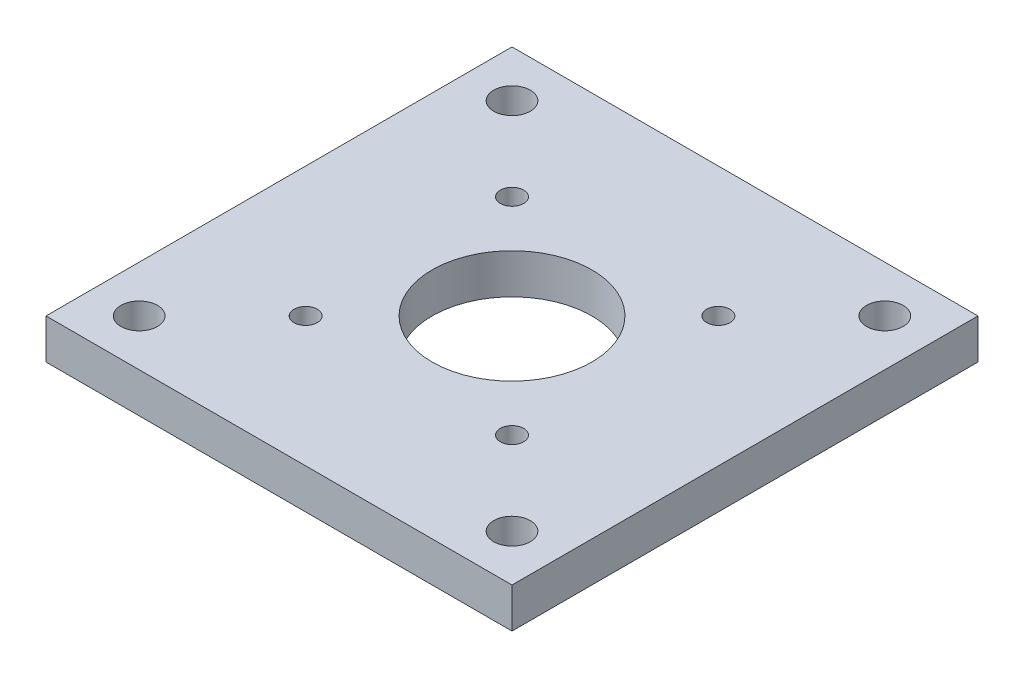
ISO-10303-21;
HEADER;
FILE_DESCRIPTION(('STEP AP214'),'2;1');
FILE_NAME('part.step','',(''),(''),'','','');
FILE_SCHEMA(('AUTOMOTIVE_DESIGN { 1 0 10303 214 1 1 1 1 }'));
ENDSEC;
DATA;
#1=APPLICATION_CONTEXT('core data for automotive mechanical design processes');
#2=APPLICATION_PROTOCOL_DEFINITION('international standard','automotive_design',2000,#1);
#3=PRODUCT_CONTEXT('',#1,'mechanical');
#4=PRODUCT('Part','Part','',(#3));
#5=PRODUCT_RELATED_PRODUCT_CATEGORY('part','',(#4));
#6=PRODUCT_DEFINITION_FORMATION('','',#4);
#7=PRODUCT_DEFINITION_CONTEXT('part definition',#1,'design');
#8=PRODUCT_DEFINITION('design','',#6,#7);
#9=PRODUCT_DEFINITION_SHAPE('','',#8);
#10=(LENGTH_UNIT() NAMED_UNIT(*) SI_UNIT(.MILLI.,.METRE.));
#11=(NAMED_UNIT(*) PLANE_ANGLE_UNIT() SI_UNIT($,.RADIAN.));
#12=(NAMED_UNIT(*) SI_UNIT($,.STERADIAN.) SOLID_ANGLE_UNIT());
#13=UNCERTAINTY_MEASURE_WITH_UNIT(LENGTH_MEASURE(1.E-05),#10,'distance_accuracy_value','');
#14=(GEOMETRIC_REPRESENTATION_CONTEXT(3) GLOBAL_UNCERTAINTY_ASSIGNED_CONTEXT((#13)) GLOBAL_UNIT_ASSIGNED_CONTEXT((#10,
#11,#12)) REPRESENTATION_CONTEXT('',''));
#15=CARTESIAN_POINT('',(0.,0.,0.));
#16=DIRECTION('',(0.,0.,1.));
#17=DIRECTION('',(1.,0.,0.));
#18=AXIS2_PLACEMENT_3D('',#15,#16,#17);
#19=CARTESIAN_POINT('',(0.,6.,0.));
#20=DIRECTION('',(0.,-1.,0.));
#21=DIRECTION('',(0.,0.,-1.));
#22=AXIS2_PLACEMENT_3D('',#19,#20,#21);
#23=PLANE('',#22);
#24=CARTESIAN_POINT('',(-28.,6.,28.));
#25=DIRECTION('',(0.,1.,0.));
#26=DIRECTION('',(0.,0.,-1.));
#27=AXIS2_PLACEMENT_3D('',#24,#25,#26);
#28=CIRCLE('',#27,2.75);
#29=CARTESIAN_POINT('',(-28.,6.,25.25));
#30=VERTEX_POINT('',#29);
#31=EDGE_CURVE('E160',#30,#30,#28,.T.);
#32=ORIENTED_EDGE('',*,*,#31,.F.);
#33=EDGE_LOOP('',(#32));
#34=FACE_BOUND('',#33,.T.);
#35=CARTESIAN_POINT('',(28.,6.,28.));
#36=DIRECTION('',(0.,1.,0.));
#37=DIRECTION('',(0.,0.,1.));
#38=AXIS2_PLACEMENT_3D('',#35,#36,#37);
#39=CIRCLE('',#38,2.75);
#40=CARTESIAN_POINT('',(28.,6.,30.75));
#41=VERTEX_POINT('',#40);
#42=EDGE_CURVE('E162',#41,#41,#39,.T.);
#43=ORIENTED_EDGE('',*,*,#42,.F.);
#44=EDGE_LOOP('',(#43));
#45=FACE_BOUND('',#44,.T.);
#46=CARTESIAN_POINT('',(28.,6.,-28.));
#47=DIRECTION('',(0.,1.,0.));
#48=DIRECTION('',(0.,0.,-1.));
#49=AXIS2_PLACEMENT_3D('',#46,#47,#48);
#50=CIRCLE('',#49,2.75);
#51=CARTESIAN_POINT('',(28.,6.,-30.75));
#52=VERTEX_POINT('',#51);
#53=EDGE_CURVE('E151',#52,#52,#50,.T.);
#54=ORIENTED_EDGE('',*,*,#53,.F.);
#55=EDGE_LOOP('',(#54));
#56=FACE_BOUND('',#55,.T.);
#57=CARTESIAN_POINT('',(-28.,6.,-28.));
#58=DIRECTION('',(0.,1.,0.));
#59=DIRECTION('',(0.,0.,1.));
#60=AXIS2_PLACEMENT_3D('',#57,#58,#59);
#61=CIRCLE('',#60,2.75);
#62=CARTESIAN_POINT('',(-28.,6.,-25.25));
#63=VERTEX_POINT('',#62);
#64=EDGE_CURVE('E146',#63,#63,#61,.T.);
#65=ORIENTED_EDGE('',*,*,#64,.F.);
#66=EDGE_LOOP('',(#65));
#67=FACE_BOUND('',#66,.T.);
#68=CARTESIAN_POINT('',(-15.5,6.,15.5));
#69=DIRECTION('',(0.,1.,0.));
#70=DIRECTION('',(0.,0.,-1.));
#71=AXIS2_PLACEMENT_3D('',#68,#69,#70);
#72=CIRCLE('',#71,1.75);
#73=CARTESIAN_POINT('',(-15.5,6.,13.75));
#74=VERTEX_POINT('',#73);
#75=EDGE_CURVE('E134',#74,#74,#72,.T.);
#76=ORIENTED_EDGE('',*,*,#75,.F.);
#77=EDGE_LOOP('',(#76));
#78=FACE_BOUND('',#77,.T.);
#79=CARTESIAN_POINT('',(15.5,6.,15.5));
#80=DIRECTION('',(0.,1.,0.));
#81=DIRECTION('',(0.,0.,1.));
#82=AXIS2_PLACEMENT_3D('',#79,#80,#81);
#83=CIRCLE('',#82,1.75);
#84=CARTESIAN_POINT('',(15.5,6.,17.25));
#85=VERTEX_POINT('',#84);
#86=EDGE_CURVE('E140',#85,#85,#83,.T.);
#87=ORIENTED_EDGE('',*,*,#86,.F.);
#88=EDGE_LOOP('',(#87));
#89=FACE_BOUND('',#88,.T.);
#90=CARTESIAN_POINT('',(15.5,6.,-15.5));
#91=DIRECTION('',(0.,1.,0.));
#92=DIRECTION('',(0.,0.,-1.));
#93=AXIS2_PLACEMENT_3D('',#90,#91,#92);
#94=CIRCLE('',#93,1.75);
#95=CARTESIAN_POINT('',(15.5,6.,-17.25));
#96=VERTEX_POINT('',#95);
#97=EDGE_CURVE('E130',#96,#96,#94,.T.);
#98=ORIENTED_EDGE('',*,*,#97,.F.);
#99=EDGE_LOOP('',(#98));
#100=FACE_BOUND('',#99,.T.);
#101=CARTESIAN_POINT('',(-15.5,6.,-15.5));
#102=DIRECTION('',(0.,1.,0.));
#103=DIRECTION('',(0.,0.,1.));
#104=AXIS2_PLACEMENT_3D('',#101,#102,#103);
#105=CIRCLE('',#104,1.75);
#106=CARTESIAN_POINT('',(-15.5,6.,-13.75));
#107=VERTEX_POINT('',#106);
#108=EDGE_CURVE('E123',#107,#107,#105,.T.);
#109=ORIENTED_EDGE('',*,*,#108,.F.);
#110=EDGE_LOOP('',(#109));
#111=FACE_BOUND('',#110,.T.);
#112=DIRECTION('',(0.,0.,-1.));
#113=VECTOR('',#112,1.);
#114=CARTESIAN_POINT('',(35.,6.,35.));
#115=LINE('',#114,#113);
#116=CARTESIAN_POINT('',(35.,6.,35.));
#117=VERTEX_POINT('',#116);
#118=CARTESIAN_POINT('',(35.,6.,-35.));
#119=VERTEX_POINT('',#118);
#120=EDGE_CURVE('E93',#117,#119,#115,.T.);
#121=ORIENTED_EDGE('',*,*,#120,.T.);
#122=DIRECTION('',(-1.,0.,0.));
#123=VECTOR('',#122,1.);
#124=CARTESIAN_POINT('',(-35.,6.,-35.));
#125=LINE('',#124,#123);
#126=CARTESIAN_POINT('',(-35.,6.,-35.));
#127=VERTEX_POINT('',#126);
#128=EDGE_CURVE('E88',#119,#127,#125,.T.);
#129=ORIENTED_EDGE('',*,*,#128,.T.);
#130=DIRECTION('',(0.,0.,1.));
#131=VECTOR('',#130,1.);
#132=CARTESIAN_POINT('',(-35.,6.,35.));
#133=LINE('',#132,#131);
#134=CARTESIAN_POINT('',(-35.,6.,35.));
#135=VERTEX_POINT('',#134);
#136=EDGE_CURVE('E90',#127,#135,#133,.T.);
#137=ORIENTED_EDGE('',*,*,#136,.T.);
#138=DIRECTION('',(1.,0.,0.));
#139=VECTOR('',#138,1.);
#140=CARTESIAN_POINT('',(-35.,6.,35.));
#141=LINE('',#140,#139);
#142=EDGE_CURVE('E57',#135,#117,#141,.T.);
#143=ORIENTED_EDGE('',*,*,#142,.T.);
#144=EDGE_LOOP('',(#121,#129,#137,#143));
#145=FACE_BOUND('',#144,.T.);
#146=CARTESIAN_POINT('',(0.,6.,0.));
#147=DIRECTION('',(0.,1.,0.));
#148=DIRECTION('',(0.,0.,1.));
#149=AXIS2_PLACEMENT_3D('',#146,#147,#148);
#150=CIRCLE('',#149,12.);
#151=CARTESIAN_POINT('',(0.,6.,12.));
#152=VERTEX_POINT('',#151);
#153=EDGE_CURVE('E106',#152,#152,#150,.T.);
#154=ORIENTED_EDGE('',*,*,#153,.F.);
#155=EDGE_LOOP('',(#154));
#156=FACE_BOUND('',#155,.T.);
#157=ADVANCED_FACE('F39',(#34,#45,#56,#67,#78,#89,#100,#111,#145,#156),#23,.F.);
#158=CARTESIAN_POINT('',(0.,0.,0.));
#159=DIRECTION('',(0.,-1.,0.));
#160=DIRECTION('',(0.,0.,-1.));
#161=AXIS2_PLACEMENT_3D('',#158,#159,#160);
#162=PLANE('',#161);
#163=CARTESIAN_POINT('',(-28.,0.,28.));
#164=DIRECTION('',(0.,1.,0.));
#165=DIRECTION('',(0.,0.,-1.));
#166=AXIS2_PLACEMENT_3D('',#163,#164,#165);
#167=CIRCLE('',#166,2.75);
#168=CARTESIAN_POINT('',(-28.,0.,25.25));
#169=VERTEX_POINT('',#168);
#170=EDGE_CURVE('E152',#169,#169,#167,.T.);
#171=ORIENTED_EDGE('',*,*,#170,.T.);
#172=EDGE_LOOP('',(#171));
#173=FACE_BOUND('',#172,.T.);
#174=CARTESIAN_POINT('',(28.,0.,28.));
#175=DIRECTION('',(0.,1.,0.));
#176=DIRECTION('',(0.,0.,1.));
#177=AXIS2_PLACEMENT_3D('',#174,#175,#176);
#178=CIRCLE('',#177,2.75);
#179=CARTESIAN_POINT('',(28.,0.,30.75));
#180=VERTEX_POINT('',#179);
#181=EDGE_CURVE('E159',#180,#180,#178,.T.);
#182=ORIENTED_EDGE('',*,*,#181,.T.);
#183=EDGE_LOOP('',(#182));
#184=FACE_BOUND('',#183,.T.);
#185=CARTESIAN_POINT('',(28.,0.,-28.));
#186=DIRECTION('',(0.,1.,0.));
#187=DIRECTION('',(0.,0.,-1.));
#188=AXIS2_PLACEMENT_3D('',#185,#186,#187);
#189=CIRCLE('',#188,2.75);
#190=CARTESIAN_POINT('',(28.,0.,-30.75));
#191=VERTEX_POINT('',#190);
#192=EDGE_CURVE('E167',#191,#191,#189,.T.);
#193=ORIENTED_EDGE('',*,*,#192,.T.);
#194=EDGE_LOOP('',(#193));
#195=FACE_BOUND('',#194,.T.);
#196=CARTESIAN_POINT('',(-28.,0.,-28.));
#197=DIRECTION('',(0.,1.,0.));
#198=DIRECTION('',(0.,0.,1.));
#199=AXIS2_PLACEMENT_3D('',#196,#197,#198);
#200=CIRCLE('',#199,2.75);
#201=CARTESIAN_POINT('',(-28.,0.,-25.25));
#202=VERTEX_POINT('',#201);
#203=EDGE_CURVE('E131',#202,#202,#200,.T.);
#204=ORIENTED_EDGE('',*,*,#203,.T.);
#205=EDGE_LOOP('',(#204));
#206=FACE_BOUND('',#205,.T.);
#207=CARTESIAN_POINT('',(-15.5,0.,15.5));
#208=DIRECTION('',(0.,1.,0.));
#209=DIRECTION('',(0.,0.,-1.));
#210=AXIS2_PLACEMENT_3D('',#207,#208,#209);
#211=CIRCLE('',#210,1.75);
#212=CARTESIAN_POINT('',(-15.5,0.,13.75));
#213=VERTEX_POINT('',#212);
#214=EDGE_CURVE('E128',#213,#213,#211,.T.);
#215=ORIENTED_EDGE('',*,*,#214,.T.);
#216=EDGE_LOOP('',(#215));
#217=FACE_BOUND('',#216,.T.);
#218=CARTESIAN_POINT('',(15.5,0.,15.5));
#219=DIRECTION('',(0.,1.,0.));
#220=DIRECTION('',(0.,0.,1.));
#221=AXIS2_PLACEMENT_3D('',#218,#219,#220);
#222=CIRCLE('',#221,1.75);
#223=CARTESIAN_POINT('',(15.5,0.,17.25));
#224=VERTEX_POINT('',#223);
#225=EDGE_CURVE('E137',#224,#224,#222,.T.);
#226=ORIENTED_EDGE('',*,*,#225,.T.);
#227=EDGE_LOOP('',(#226));
#228=FACE_BOUND('',#227,.T.);
#229=CARTESIAN_POINT('',(15.5,0.,-15.5));
#230=DIRECTION('',(0.,1.,0.));
#231=DIRECTION('',(0.,0.,-1.));
#232=AXIS2_PLACEMENT_3D('',#229,#230,#231);
#233=CIRCLE('',#232,1.75);
#234=CARTESIAN_POINT('',(15.5,0.,-17.25));
#235=VERTEX_POINT('',#234);
#236=EDGE_CURVE('E141',#235,#235,#233,.T.);
#237=ORIENTED_EDGE('',*,*,#236,.T.);
#238=EDGE_LOOP('',(#237));
#239=FACE_BOUND('',#238,.T.);
#240=CARTESIAN_POINT('',(-15.5,0.,-15.5));
#241=DIRECTION('',(0.,1.,0.));
#242=DIRECTION('',(0.,0.,1.));
#243=AXIS2_PLACEMENT_3D('',#240,#241,#242);
#244=CIRCLE('',#243,1.75);
#245=CARTESIAN_POINT('',(-15.5,0.,-13.75));
#246=VERTEX_POINT('',#245);
#247=EDGE_CURVE('E121',#246,#246,#244,.T.);
#248=ORIENTED_EDGE('',*,*,#247,.T.);
#249=EDGE_LOOP('',(#248));
#250=FACE_BOUND('',#249,.T.);
#251=DIRECTION('',(0.,0.,-1.));
#252=VECTOR('',#251,1.);
#253=CARTESIAN_POINT('',(35.,0.,35.));
#254=LINE('',#253,#252);
#255=CARTESIAN_POINT('',(35.,0.,35.));
#256=VERTEX_POINT('',#255);
#257=CARTESIAN_POINT('',(35.,0.,-35.));
#258=VERTEX_POINT('',#257);
#259=EDGE_CURVE('E103',#256,#258,#254,.T.);
#260=ORIENTED_EDGE('',*,*,#259,.F.);
#261=DIRECTION('',(1.,0.,0.));
#262=VECTOR('',#261,1.);
#263=CARTESIAN_POINT('',(-35.,0.,35.));
#264=LINE('',#263,#262);
#265=CARTESIAN_POINT('',(-35.,0.,35.));
#266=VERTEX_POINT('',#265);
#267=EDGE_CURVE('E76',#266,#256,#264,.T.);
#268=ORIENTED_EDGE('',*,*,#267,.F.);
#269=DIRECTION('',(0.,0.,1.));
#270=VECTOR('',#269,1.);
#271=CARTESIAN_POINT('',(-35.,0.,35.));
#272=LINE('',#271,#270);
#273=CARTESIAN_POINT('',(-35.,0.,-35.));
#274=VERTEX_POINT('',#273);
#275=EDGE_CURVE('E71',#274,#266,#272,.T.);
#276=ORIENTED_EDGE('',*,*,#275,.F.);
#277=DIRECTION('',(-1.,0.,0.));
#278=VECTOR('',#277,1.);
#279=CARTESIAN_POINT('',(-35.,0.,-35.));
#280=LINE('',#279,#278);
#281=EDGE_CURVE('E92',#258,#274,#280,.T.);
#282=ORIENTED_EDGE('',*,*,#281,.F.);
#283=EDGE_LOOP('',(#260,#268,#276,#282));
#284=FACE_BOUND('',#283,.T.);
#285=CARTESIAN_POINT('',(0.,0.,0.));
#286=DIRECTION('',(0.,1.,0.));
#287=DIRECTION('',(0.,0.,1.));
#288=AXIS2_PLACEMENT_3D('',#285,#286,#287);
#289=CIRCLE('',#288,12.);
#290=CARTESIAN_POINT('',(0.,0.,12.));
#291=VERTEX_POINT('',#290);
#292=EDGE_CURVE('E119',#291,#291,#289,.T.);
#293=ORIENTED_EDGE('',*,*,#292,.T.);
#294=EDGE_LOOP('',(#293));
#295=FACE_BOUND('',#294,.T.);
#296=ADVANCED_FACE('F111',(#173,#184,#195,#206,#217,#228,#239,#250,#284,#295),#162,.T.);
#297=CARTESIAN_POINT('',(35.,6.,35.));
#298=DIRECTION('',(-1.,0.,0.));
#299=DIRECTION('',(0.,0.,1.));
#300=AXIS2_PLACEMENT_3D('',#297,#298,#299);
#301=PLANE('',#300);
#302=ORIENTED_EDGE('',*,*,#259,.T.);
#303=DIRECTION('',(0.,-1.,0.));
#304=VECTOR('',#303,1.);
#305=CARTESIAN_POINT('',(35.,6.,-35.));
#306=LINE('',#305,#304);
#307=EDGE_CURVE('E11',#119,#258,#306,.T.);
#308=ORIENTED_EDGE('',*,*,#307,.F.);
#309=ORIENTED_EDGE('',*,*,#120,.F.);
#310=DIRECTION('',(0.,-1.,0.));
#311=VECTOR('',#310,1.);
#312=CARTESIAN_POINT('',(35.,6.,35.));
#313=LINE('',#312,#311);
#314=EDGE_CURVE('E97',#117,#256,#313,.T.);
#315=ORIENTED_EDGE('',*,*,#314,.T.);
#316=EDGE_LOOP('',(#302,#308,#309,#315));
#317=FACE_BOUND('',#316,.T.);
#318=ADVANCED_FACE('F41',(#317),#301,.F.);
#319=CARTESIAN_POINT('',(-35.,6.,-35.));
#320=DIRECTION('',(0.,0.,1.));
#321=DIRECTION('',(1.,0.,0.));
#322=AXIS2_PLACEMENT_3D('',#319,#320,#321);
#323=PLANE('',#322);
#324=ORIENTED_EDGE('',*,*,#281,.T.);
#325=DIRECTION('',(0.,-1.,0.));
#326=VECTOR('',#325,1.);
#327=CARTESIAN_POINT('',(-35.,6.,-35.));
#328=LINE('',#327,#326);
#329=EDGE_CURVE('E48',#127,#274,#328,.T.);
#330=ORIENTED_EDGE('',*,*,#329,.F.);
#331=ORIENTED_EDGE('',*,*,#128,.F.);
#332=ORIENTED_EDGE('',*,*,#307,.T.);
#333=EDGE_LOOP('',(#324,#330,#331,#332));
#334=FACE_BOUND('',#333,.T.);
#335=ADVANCED_FACE('F94',(#334),#323,.F.);
#336=CARTESIAN_POINT('',(-35.,6.,35.));
#337=DIRECTION('',(1.,0.,0.));
#338=DIRECTION('',(0.,0.,-1.));
#339=AXIS2_PLACEMENT_3D('',#336,#337,#338);
#340=PLANE('',#339);
#341=ORIENTED_EDGE('',*,*,#275,.T.);
#342=DIRECTION('',(0.,-1.,0.));
#343=VECTOR('',#342,1.);
#344=CARTESIAN_POINT('',(-35.,6.,35.));
#345=LINE('',#344,#343);
#346=EDGE_CURVE('E96',#135,#266,#345,.T.);
#347=ORIENTED_EDGE('',*,*,#346,.F.);
#348=ORIENTED_EDGE('',*,*,#136,.F.);
#349=ORIENTED_EDGE('',*,*,#329,.T.);
#350=EDGE_LOOP('',(#341,#347,#348,#349));
#351=FACE_BOUND('',#350,.T.);
#352=ADVANCED_FACE('F100',(#351),#340,.F.);
#353=CARTESIAN_POINT('',(-35.,6.,35.));
#354=DIRECTION('',(0.,0.,-1.));
#355=DIRECTION('',(-1.,0.,0.));
#356=AXIS2_PLACEMENT_3D('',#353,#354,#355);
#357=PLANE('',#356);
#358=ORIENTED_EDGE('',*,*,#267,.T.);
#359=ORIENTED_EDGE('',*,*,#314,.F.);
#360=ORIENTED_EDGE('',*,*,#142,.F.);
#361=ORIENTED_EDGE('',*,*,#346,.T.);
#362=EDGE_LOOP('',(#358,#359,#360,#361));
#363=FACE_BOUND('',#362,.T.);
#364=ADVANCED_FACE('F112',(#363),#357,.F.);
#365=CARTESIAN_POINT('',(0.,6.,0.));
#366=DIRECTION('',(0.,-1.,0.));
#367=DIRECTION('',(0.,0.,-1.));
#368=AXIS2_PLACEMENT_3D('',#365,#366,#367);
#369=CYLINDRICAL_SURFACE('',#368,12.);
#370=ORIENTED_EDGE('',*,*,#153,.T.);
#371=EDGE_LOOP('',(#370));
#372=FACE_BOUND('',#371,.T.);
#373=ORIENTED_EDGE('',*,*,#292,.F.);
#374=EDGE_LOOP('',(#373));
#375=FACE_BOUND('',#374,.T.);
#376=ADVANCED_FACE('F191',(#372,#375),#369,.F.);
#377=CARTESIAN_POINT('',(-15.5,0.,-15.5));
#378=DIRECTION('',(0.,1.,0.));
#379=DIRECTION('',(0.,0.,1.));
#380=AXIS2_PLACEMENT_3D('',#377,#378,#379);
#381=CYLINDRICAL_SURFACE('',#380,1.75);
#382=ORIENTED_EDGE('',*,*,#247,.F.);
#383=EDGE_LOOP('',(#382));
#384=FACE_BOUND('',#383,.T.);
#385=ORIENTED_EDGE('',*,*,#108,.T.);
#386=EDGE_LOOP('',(#385));
#387=FACE_BOUND('',#386,.T.);
#388=ADVANCED_FACE('F189',(#384,#387),#381,.F.);
#389=CARTESIAN_POINT('',(15.5,0.,-15.5));
#390=DIRECTION('',(0.,1.,0.));
#391=DIRECTION('',(0.,0.,1.));
#392=AXIS2_PLACEMENT_3D('',#389,#390,#391);
#393=CYLINDRICAL_SURFACE('',#392,1.75);
#394=ORIENTED_EDGE('',*,*,#236,.F.);
#395=EDGE_LOOP('',(#394));
#396=FACE_BOUND('',#395,.T.);
#397=ORIENTED_EDGE('',*,*,#97,.T.);
#398=EDGE_LOOP('',(#397));
#399=FACE_BOUND('',#398,.T.);
#400=ADVANCED_FACE('F188',(#396,#399),#393,.F.);
#401=CARTESIAN_POINT('',(15.5,0.,15.5));
#402=DIRECTION('',(0.,1.,0.));
#403=DIRECTION('',(0.,0.,1.));
#404=AXIS2_PLACEMENT_3D('',#401,#402,#403);
#405=CYLINDRICAL_SURFACE('',#404,1.75);
#406=ORIENTED_EDGE('',*,*,#225,.F.);
#407=EDGE_LOOP('',(#406));
#408=FACE_BOUND('',#407,.T.);
#409=ORIENTED_EDGE('',*,*,#86,.T.);
#410=EDGE_LOOP('',(#409));
#411=FACE_BOUND('',#410,.T.);
#412=ADVANCED_FACE('F196',(#408,#411),#405,.F.);
#413=CARTESIAN_POINT('',(-15.5,0.,15.5));
#414=DIRECTION('',(0.,1.,0.));
#415=DIRECTION('',(0.,0.,1.));
#416=AXIS2_PLACEMENT_3D('',#413,#414,#415);
#417=CYLINDRICAL_SURFACE('',#416,1.75);
#418=ORIENTED_EDGE('',*,*,#214,.F.);
#419=EDGE_LOOP('',(#418));
#420=FACE_BOUND('',#419,.T.);
#421=ORIENTED_EDGE('',*,*,#75,.T.);
#422=EDGE_LOOP('',(#421));
#423=FACE_BOUND('',#422,.T.);
#424=ADVANCED_FACE('F202',(#420,#423),#417,.F.);
#425=CARTESIAN_POINT('',(-28.,0.,-28.));
#426=DIRECTION('',(0.,1.,0.));
#427=DIRECTION('',(0.,0.,1.));
#428=AXIS2_PLACEMENT_3D('',#425,#426,#427);
#429=CYLINDRICAL_SURFACE('',#428,2.75);
#430=ORIENTED_EDGE('',*,*,#203,.F.);
#431=EDGE_LOOP('',(#430));
#432=FACE_BOUND('',#431,.T.);
#433=ORIENTED_EDGE('',*,*,#64,.T.);
#434=EDGE_LOOP('',(#433));
#435=FACE_BOUND('',#434,.T.);
#436=ADVANCED_FACE('F274',(#432,#435),#429,.F.);
#437=CARTESIAN_POINT('',(28.,0.,-28.));
#438=DIRECTION('',(0.,1.,0.));
#439=DIRECTION('',(0.,0.,1.));
#440=AXIS2_PLACEMENT_3D('',#437,#438,#439);
#441=CYLINDRICAL_SURFACE('',#440,2.75);
#442=ORIENTED_EDGE('',*,*,#192,.F.);
#443=EDGE_LOOP('',(#442));
#444=FACE_BOUND('',#443,.T.);
#445=ORIENTED_EDGE('',*,*,#53,.T.);
#446=EDGE_LOOP('',(#445));
#447=FACE_BOUND('',#446,.T.);
#448=ADVANCED_FACE('F175',(#444,#447),#441,.F.);
#449=CARTESIAN_POINT('',(28.,0.,28.));
#450=DIRECTION('',(0.,1.,0.));
#451=DIRECTION('',(0.,0.,1.));
#452=AXIS2_PLACEMENT_3D('',#449,#450,#451);
#453=CYLINDRICAL_SURFACE('',#452,2.75);
#454=ORIENTED_EDGE('',*,*,#181,.F.);
#455=EDGE_LOOP('',(#454));
#456=FACE_BOUND('',#455,.T.);
#457=ORIENTED_EDGE('',*,*,#42,.T.);
#458=EDGE_LOOP('',(#457));
#459=FACE_BOUND('',#458,.T.);
#460=ADVANCED_FACE('F291',(#456,#459),#453,.F.);
#461=CARTESIAN_POINT('',(-28.,0.,28.));
#462=DIRECTION('',(0.,1.,0.));
#463=DIRECTION('',(0.,0.,1.));
#464=AXIS2_PLACEMENT_3D('',#461,#462,#463);
#465=CYLINDRICAL_SURFACE('',#464,2.75);
#466=ORIENTED_EDGE('',*,*,#170,.F.);
#467=EDGE_LOOP('',(#466));
#468=FACE_BOUND('',#467,.T.);
#469=ORIENTED_EDGE('',*,*,#31,.T.);
#470=EDGE_LOOP('',(#469));
#471=FACE_BOUND('',#470,.T.);
#472=ADVANCED_FACE('F304',(#468,#471),#465,.F.);
#473=CLOSED_SHELL('',(#157,#296,#318,#335,#352,#364,#376,#388,#400,#412,#424,#436,#448,#460,#472));
#474=MANIFOLD_SOLID_BREP('B2',#473);
#475=ADVANCED_BREP_SHAPE_REPRESENTATION('',(#18,#474),#14);
#476=SHAPE_DEFINITION_REPRESENTATION(#9,#475);
ENDSEC;
END-ISO-10303-21;
